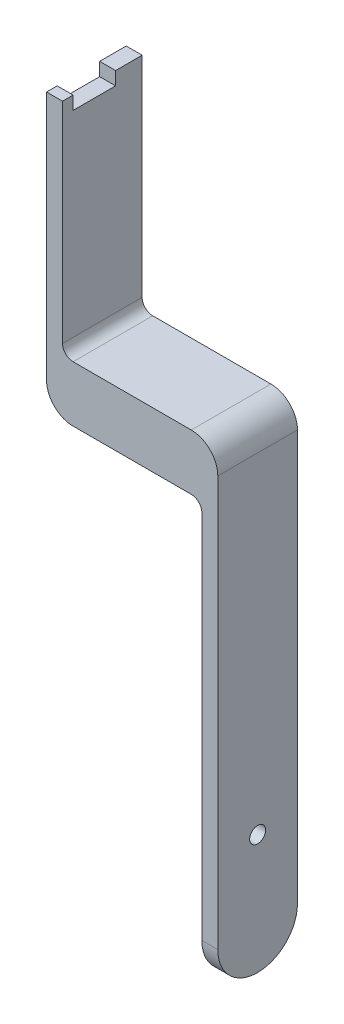
ISO-10303-21;
HEADER;
FILE_DESCRIPTION(('STEP AP214'),'2;1');
FILE_NAME('part.step','',(''),(''),'','','');
FILE_SCHEMA(('AUTOMOTIVE_DESIGN { 1 0 10303 214 1 1 1 1 }'));
ENDSEC;
DATA;
#1=APPLICATION_CONTEXT('core data for automotive mechanical design processes');
#2=APPLICATION_PROTOCOL_DEFINITION('international standard','automotive_design',2000,#1);
#3=PRODUCT_CONTEXT('',#1,'mechanical');
#4=PRODUCT('Part','Part','',(#3));
#5=PRODUCT_RELATED_PRODUCT_CATEGORY('part','',(#4));
#6=PRODUCT_DEFINITION_FORMATION('','',#4);
#7=PRODUCT_DEFINITION_CONTEXT('part definition',#1,'design');
#8=PRODUCT_DEFINITION('design','',#6,#7);
#9=PRODUCT_DEFINITION_SHAPE('','',#8);
#10=(LENGTH_UNIT() NAMED_UNIT(*) SI_UNIT(.MILLI.,.METRE.));
#11=(NAMED_UNIT(*) PLANE_ANGLE_UNIT() SI_UNIT($,.RADIAN.));
#12=(NAMED_UNIT(*) SI_UNIT($,.STERADIAN.) SOLID_ANGLE_UNIT());
#13=UNCERTAINTY_MEASURE_WITH_UNIT(LENGTH_MEASURE(1.E-05),#10,'distance_accuracy_value','');
#14=(GEOMETRIC_REPRESENTATION_CONTEXT(3) GLOBAL_UNCERTAINTY_ASSIGNED_CONTEXT((#13)) GLOBAL_UNIT_ASSIGNED_CONTEXT((#10,
#11,#12)) REPRESENTATION_CONTEXT('',''));
#15=CARTESIAN_POINT('',(0.,0.,0.));
#16=DIRECTION('',(0.,0.,1.));
#17=DIRECTION('',(1.,0.,0.));
#18=AXIS2_PLACEMENT_3D('',#15,#16,#17);
#19=CARTESIAN_POINT('',(39.9999999999999,44.5022128562179,-105.530592625912));
#20=DIRECTION('',(0.,1.,0.));
#21=DIRECTION('',(0.,0.,1.));
#22=AXIS2_PLACEMENT_3D('',#19,#20,#21);
#23=PLANE('',#22);
#24=DIRECTION('',(-1.,0.,0.));
#25=VECTOR('',#24,1.);
#26=CARTESIAN_POINT('',(72.251106428109,44.5022128562179,-92.5305926259119));
#27=LINE('',#26,#25);
#28=CARTESIAN_POINT('',(43.,44.5022128562179,-92.5305926259119));
#29=VERTEX_POINT('',#28);
#30=CARTESIAN_POINT('',(39.9999999999999,44.5022128562179,-92.5305926259119));
#31=VERTEX_POINT('',#30);
#32=EDGE_CURVE('E147',#29,#31,#27,.T.);
#33=ORIENTED_EDGE('',*,*,#32,.T.);
#34=DIRECTION('',(0.,0.,1.));
#35=VECTOR('',#34,1.);
#36=CARTESIAN_POINT('',(39.9999999999999,44.5022128562179,-105.530592625912));
#37=LINE('',#36,#35);
#38=CARTESIAN_POINT('',(39.9999999999999,44.5022128562179,-90.5305926259119));
#39=VERTEX_POINT('',#38);
#40=EDGE_CURVE('E161',#31,#39,#37,.T.);
#41=ORIENTED_EDGE('',*,*,#40,.T.);
#42=DIRECTION('',(1.,0.,0.));
#43=VECTOR('',#42,1.);
#44=CARTESIAN_POINT('',(39.9999999999999,44.5022128562179,-90.5305926259119));
#45=LINE('',#44,#43);
#46=CARTESIAN_POINT('',(43.,44.5022128562179,-90.5305926259118));
#47=VERTEX_POINT('',#46);
#48=EDGE_CURVE('E193',#39,#47,#45,.T.);
#49=ORIENTED_EDGE('',*,*,#48,.T.);
#50=DIRECTION('',(0.,0.,-1.));
#51=VECTOR('',#50,1.);
#52=CARTESIAN_POINT('',(43.,44.5022128562179,-90.5305926259118));
#53=LINE('',#52,#51);
#54=EDGE_CURVE('E164',#47,#29,#53,.T.);
#55=ORIENTED_EDGE('',*,*,#54,.T.);
#56=EDGE_LOOP('',(#33,#41,#49,#55));
#57=FACE_BOUND('',#56,.T.);
#58=ADVANCED_FACE('F33',(#57),#23,.T.);
#59=CARTESIAN_POINT('',(39.9999999999999,-79.2511064281089,-98.0305926259119));
#60=DIRECTION('',(1.,0.,0.));
#61=DIRECTION('',(0.,0.,-1.));
#62=AXIS2_PLACEMENT_3D('',#59,#60,#61);
#63=CYLINDRICAL_SURFACE('',#62,7.50000000000005);
#64=CARTESIAN_POINT('',(69.2511064281086,-79.2511064281089,-98.0305926259119));
#65=DIRECTION('',(1.,0.,0.));
#66=DIRECTION('',(0.,1.,0.));
#67=AXIS2_PLACEMENT_3D('',#64,#65,#66);
#68=CIRCLE('',#67,7.50000000000005);
#69=CARTESIAN_POINT('',(69.2511064281086,-79.2511064281089,-105.530592625912));
#70=VERTEX_POINT('',#69);
#71=CARTESIAN_POINT('',(69.2511064281086,-79.2511064281089,-90.5305926259118));
#72=VERTEX_POINT('',#71);
#73=EDGE_CURVE('E254',#70,#72,#68,.F.);
#74=ORIENTED_EDGE('',*,*,#73,.F.);
#75=DIRECTION('',(1.,0.,0.));
#76=VECTOR('',#75,1.);
#77=CARTESIAN_POINT('',(39.9999999999999,-79.2511064281089,-105.530592625912));
#78=LINE('',#77,#76);
#79=CARTESIAN_POINT('',(72.2511064281089,-79.2511064281089,-105.530592625912));
#80=VERTEX_POINT('',#79);
#81=EDGE_CURVE('E182',#70,#80,#78,.T.);
#82=ORIENTED_EDGE('',*,*,#81,.T.);
#83=CARTESIAN_POINT('',(72.2511064281089,-79.2511064281089,-98.0305926259119));
#84=DIRECTION('',(1.,0.,0.));
#85=DIRECTION('',(0.,0.,-1.));
#86=AXIS2_PLACEMENT_3D('',#83,#84,#85);
#87=CIRCLE('',#86,7.50000000000005);
#88=CARTESIAN_POINT('',(72.2511064281089,-79.2511064281089,-90.5305926259119));
#89=VERTEX_POINT('',#88);
#90=EDGE_CURVE('E183',#89,#80,#87,.T.);
#91=ORIENTED_EDGE('',*,*,#90,.F.);
#92=DIRECTION('',(1.,0.,0.));
#93=VECTOR('',#92,1.);
#94=CARTESIAN_POINT('',(39.9999999999999,-79.2511064281089,-90.5305926259119));
#95=LINE('',#94,#93);
#96=EDGE_CURVE('E189',#72,#89,#95,.T.);
#97=ORIENTED_EDGE('',*,*,#96,.F.);
#98=EDGE_LOOP('',(#74,#82,#91,#97));
#99=FACE_BOUND('',#98,.T.);
#100=ADVANCED_FACE('F309',(#99),#63,.T.);
#101=CARTESIAN_POINT('',(39.9999999999999,44.5022128562179,-90.5305926259119));
#102=DIRECTION('',(0.,0.,1.));
#103=DIRECTION('',(0.,-1.,0.));
#104=AXIS2_PLACEMENT_3D('',#101,#102,#103);
#105=PLANE('',#104);
#106=DIRECTION('',(0.,-1.,0.));
#107=VECTOR('',#106,1.);
#108=CARTESIAN_POINT('',(39.9999999999999,44.5022128562179,-90.5305926259119));
#109=LINE('',#108,#107);
#110=CARTESIAN_POINT('',(39.9999999999999,-2.50000000000003,-90.5305926259119));
#111=VERTEX_POINT('',#110);
#112=EDGE_CURVE('E172',#39,#111,#109,.T.);
#113=ORIENTED_EDGE('',*,*,#112,.T.);
#114=CARTESIAN_POINT('',(44.9999999999999,-2.50000000000005,-90.5305926259119));
#115=DIRECTION('',(0.,0.,1.));
#116=DIRECTION('',(0.,-1.,0.));
#117=AXIS2_PLACEMENT_3D('',#114,#115,#116);
#118=CIRCLE('',#117,5.);
#119=CARTESIAN_POINT('',(44.9999999999999,-7.50000000000005,-90.5305926259118));
#120=VERTEX_POINT('',#119);
#121=EDGE_CURVE('E238',#111,#120,#118,.T.);
#122=ORIENTED_EDGE('',*,*,#121,.T.);
#123=DIRECTION('',(1.,0.,0.));
#124=VECTOR('',#123,1.);
#125=CARTESIAN_POINT('',(39.9999999999996,-7.50000000000004,-90.5305926259118));
#126=LINE('',#125,#124);
#127=CARTESIAN_POINT('',(67.2511064281086,-7.50000000000005,-90.5305926259118));
#128=VERTEX_POINT('',#127);
#129=EDGE_CURVE('E273',#120,#128,#126,.T.);
#130=ORIENTED_EDGE('',*,*,#129,.T.);
#131=CARTESIAN_POINT('',(67.2511064281086,-9.50000000000005,-90.5305926259119));
#132=DIRECTION('',(0.,0.,1.));
#133=DIRECTION('',(0.,-1.,0.));
#134=AXIS2_PLACEMENT_3D('',#131,#132,#133);
#135=CIRCLE('',#134,2.);
#136=CARTESIAN_POINT('',(69.2511064281086,-9.50000000000005,-90.5305926259118));
#137=VERTEX_POINT('',#136);
#138=EDGE_CURVE('E226',#128,#137,#135,.F.);
#139=ORIENTED_EDGE('',*,*,#138,.T.);
#140=DIRECTION('',(0.,-1.,0.));
#141=VECTOR('',#140,1.);
#142=CARTESIAN_POINT('',(69.2511064281086,-7.50000000000005,-90.5305926259118));
#143=LINE('',#142,#141);
#144=EDGE_CURVE('E258',#137,#72,#143,.T.);
#145=ORIENTED_EDGE('',*,*,#144,.T.);
#146=ORIENTED_EDGE('',*,*,#96,.T.);
#147=DIRECTION('',(0.,-1.,0.));
#148=VECTOR('',#147,1.);
#149=CARTESIAN_POINT('',(72.2511064281089,44.5022128562179,-90.5305926259119));
#150=LINE('',#149,#148);
#151=CARTESIAN_POINT('',(72.2511064281089,-1.99999999999998,-90.5305926259119));
#152=VERTEX_POINT('',#151);
#153=EDGE_CURVE('E177',#152,#89,#150,.T.);
#154=ORIENTED_EDGE('',*,*,#153,.F.);
#155=CARTESIAN_POINT('',(67.2511064281089,-2.,-90.5305926259119));
#156=DIRECTION('',(0.,0.,1.));
#157=DIRECTION('',(0.,-1.,0.));
#158=AXIS2_PLACEMENT_3D('',#155,#156,#157);
#159=CIRCLE('',#158,5.);
#160=CARTESIAN_POINT('',(67.2511064281089,3.,-90.5305926259118));
#161=VERTEX_POINT('',#160);
#162=EDGE_CURVE('E48',#152,#161,#159,.T.);
#163=ORIENTED_EDGE('',*,*,#162,.T.);
#164=DIRECTION('',(-1.,0.,0.));
#165=VECTOR('',#164,1.);
#166=CARTESIAN_POINT('',(72.251106428109,3.,-90.5305926259118));
#167=LINE('',#166,#165);
#168=CARTESIAN_POINT('',(44.9999999999999,3.,-90.5305926259118));
#169=VERTEX_POINT('',#168);
#170=EDGE_CURVE('E245',#161,#169,#167,.T.);
#171=ORIENTED_EDGE('',*,*,#170,.T.);
#172=CARTESIAN_POINT('',(44.9999999999999,5.,-90.5305926259119));
#173=DIRECTION('',(0.,0.,1.));
#174=DIRECTION('',(0.,-1.,0.));
#175=AXIS2_PLACEMENT_3D('',#172,#173,#174);
#176=CIRCLE('',#175,2.);
#177=CARTESIAN_POINT('',(42.9999999999999,5.00000000000001,-90.5305926259118));
#178=VERTEX_POINT('',#177);
#179=EDGE_CURVE('E221',#169,#178,#176,.F.);
#180=ORIENTED_EDGE('',*,*,#179,.T.);
#181=DIRECTION('',(0.,1.,0.));
#182=VECTOR('',#181,1.);
#183=CARTESIAN_POINT('',(42.9999999999999,3.,-90.5305926259118));
#184=LINE('',#183,#182);
#185=EDGE_CURVE('E261',#178,#47,#184,.T.);
#186=ORIENTED_EDGE('',*,*,#185,.T.);
#187=ORIENTED_EDGE('',*,*,#48,.F.);
#188=EDGE_LOOP('',(#113,#122,#130,#139,#145,#146,#154,#163,#171,#180,#186,#187));
#189=FACE_BOUND('',#188,.T.);
#190=ADVANCED_FACE('F311',(#189),#105,.T.);
#191=DIRECTION('',(-1.,0.,0.));
#192=VECTOR('',#191,1.);
#193=CARTESIAN_POINT('',(72.251106428109,44.5022128562179,-100.530592625912));
#194=LINE('',#193,#192);
#195=CARTESIAN_POINT('',(43.,44.5022128562179,-100.530592625912));
#196=VERTEX_POINT('',#195);
#197=CARTESIAN_POINT('',(39.9999999999999,44.5022128562179,-100.530592625912));
#198=VERTEX_POINT('',#197);
#199=EDGE_CURVE('E165',#196,#198,#194,.T.);
#200=ORIENTED_EDGE('',*,*,#199,.F.);
#201=CARTESIAN_POINT('',(43.,44.5022128562179,-105.530592625912));
#202=VERTEX_POINT('',#201);
#203=EDGE_CURVE('E263',#196,#202,#53,.T.);
#204=ORIENTED_EDGE('',*,*,#203,.T.);
#205=DIRECTION('',(1.,0.,0.));
#206=VECTOR('',#205,1.);
#207=CARTESIAN_POINT('',(39.9999999999999,44.5022128562179,-105.530592625912));
#208=LINE('',#207,#206);
#209=CARTESIAN_POINT('',(39.9999999999999,44.5022128562179,-105.530592625912));
#210=VERTEX_POINT('',#209);
#211=EDGE_CURVE('E195',#210,#202,#208,.T.);
#212=ORIENTED_EDGE('',*,*,#211,.F.);
#213=EDGE_CURVE('E173',#210,#198,#37,.T.);
#214=ORIENTED_EDGE('',*,*,#213,.T.);
#215=EDGE_LOOP('',(#200,#204,#212,#214));
#216=FACE_BOUND('',#215,.T.);
#217=ADVANCED_FACE('F320',(#216),#23,.T.);
#218=CARTESIAN_POINT('',(39.9999999999999,-79.2511064281089,-105.530592625912));
#219=DIRECTION('',(0.,0.,-1.));
#220=DIRECTION('',(-1.,0.,0.));
#221=AXIS2_PLACEMENT_3D('',#218,#219,#220);
#222=PLANE('',#221);
#223=DIRECTION('',(1.,0.,0.));
#224=VECTOR('',#223,1.);
#225=CARTESIAN_POINT('',(39.9999999999996,-7.50000000000004,-105.530592625912));
#226=LINE('',#225,#224);
#227=CARTESIAN_POINT('',(44.9999999999999,-7.50000000000005,-105.530592625912));
#228=VERTEX_POINT('',#227);
#229=CARTESIAN_POINT('',(67.2511064281086,-7.50000000000005,-105.530592625912));
#230=VERTEX_POINT('',#229);
#231=EDGE_CURVE('E274',#228,#230,#226,.T.);
#232=ORIENTED_EDGE('',*,*,#231,.F.);
#233=CARTESIAN_POINT('',(44.9999999999999,-2.50000000000005,-105.530592625912));
#234=DIRECTION('',(0.,0.,-1.));
#235=DIRECTION('',(-1.,0.,0.));
#236=AXIS2_PLACEMENT_3D('',#233,#234,#235);
#237=CIRCLE('',#236,5.);
#238=CARTESIAN_POINT('',(39.9999999999999,-2.50000000000007,-105.530592625912));
#239=VERTEX_POINT('',#238);
#240=EDGE_CURVE('E233',#228,#239,#237,.T.);
#241=ORIENTED_EDGE('',*,*,#240,.T.);
#242=DIRECTION('',(0.,1.,0.));
#243=VECTOR('',#242,1.);
#244=CARTESIAN_POINT('',(39.9999999999999,-79.2511064281089,-105.530592625912));
#245=LINE('',#244,#243);
#246=EDGE_CURVE('E174',#239,#210,#245,.T.);
#247=ORIENTED_EDGE('',*,*,#246,.T.);
#248=ORIENTED_EDGE('',*,*,#211,.T.);
#249=DIRECTION('',(0.,1.,0.));
#250=VECTOR('',#249,1.);
#251=CARTESIAN_POINT('',(42.9999999999999,3.,-105.530592625912));
#252=LINE('',#251,#250);
#253=CARTESIAN_POINT('',(42.9999999999999,5.00000000000001,-105.530592625912));
#254=VERTEX_POINT('',#253);
#255=EDGE_CURVE('E253',#254,#202,#252,.T.);
#256=ORIENTED_EDGE('',*,*,#255,.F.);
#257=CARTESIAN_POINT('',(44.9999999999999,5.,-105.530592625912));
#258=DIRECTION('',(0.,0.,-1.));
#259=DIRECTION('',(-1.,0.,0.));
#260=AXIS2_PLACEMENT_3D('',#257,#258,#259);
#261=CIRCLE('',#260,2.);
#262=CARTESIAN_POINT('',(44.9999999999999,3.,-105.530592625912));
#263=VERTEX_POINT('',#262);
#264=EDGE_CURVE('E218',#254,#263,#261,.F.);
#265=ORIENTED_EDGE('',*,*,#264,.T.);
#266=DIRECTION('',(-1.,0.,0.));
#267=VECTOR('',#266,1.);
#268=CARTESIAN_POINT('',(72.251106428109,3.,-105.530592625912));
#269=LINE('',#268,#267);
#270=CARTESIAN_POINT('',(67.2511064281089,3.,-105.530592625912));
#271=VERTEX_POINT('',#270);
#272=EDGE_CURVE('E244',#271,#263,#269,.T.);
#273=ORIENTED_EDGE('',*,*,#272,.F.);
#274=CARTESIAN_POINT('',(67.2511064281089,-2.,-105.530592625912));
#275=DIRECTION('',(0.,0.,-1.));
#276=DIRECTION('',(-1.,0.,0.));
#277=AXIS2_PLACEMENT_3D('',#274,#275,#276);
#278=CIRCLE('',#277,5.);
#279=CARTESIAN_POINT('',(72.2511064281089,-2.00000000000003,-105.530592625912));
#280=VERTEX_POINT('',#279);
#281=EDGE_CURVE('E231',#271,#280,#278,.T.);
#282=ORIENTED_EDGE('',*,*,#281,.T.);
#283=DIRECTION('',(0.,1.,0.));
#284=VECTOR('',#283,1.);
#285=CARTESIAN_POINT('',(72.2511064281089,-79.2511064281089,-105.530592625912));
#286=LINE('',#285,#284);
#287=EDGE_CURVE('E186',#80,#280,#286,.T.);
#288=ORIENTED_EDGE('',*,*,#287,.F.);
#289=ORIENTED_EDGE('',*,*,#81,.F.);
#290=DIRECTION('',(0.,-1.,0.));
#291=VECTOR('',#290,1.);
#292=CARTESIAN_POINT('',(69.2511064281086,-7.50000000000005,-105.530592625912));
#293=LINE('',#292,#291);
#294=CARTESIAN_POINT('',(69.2511064281086,-9.50000000000005,-105.530592625912));
#295=VERTEX_POINT('',#294);
#296=EDGE_CURVE('E271',#295,#70,#293,.T.);
#297=ORIENTED_EDGE('',*,*,#296,.F.);
#298=CARTESIAN_POINT('',(67.2511064281086,-9.50000000000005,-105.530592625912));
#299=DIRECTION('',(0.,0.,-1.));
#300=DIRECTION('',(-1.,0.,0.));
#301=AXIS2_PLACEMENT_3D('',#298,#299,#300);
#302=CIRCLE('',#301,2.);
#303=EDGE_CURVE('E223',#295,#230,#302,.F.);
#304=ORIENTED_EDGE('',*,*,#303,.T.);
#305=EDGE_LOOP('',(#232,#241,#247,#248,#256,#265,#273,#282,#288,#289,#297,#304));
#306=FACE_BOUND('',#305,.T.);
#307=ADVANCED_FACE('F249',(#306),#222,.T.);
#308=CARTESIAN_POINT('',(39.9999999999999,-79.2511064281089,-98.0305926259119));
#309=DIRECTION('',(1.,0.,0.));
#310=DIRECTION('',(0.,0.,-1.));
#311=AXIS2_PLACEMENT_3D('',#308,#309,#310);
#312=PLANE('',#311);
#313=ORIENTED_EDGE('',*,*,#246,.F.);
#314=DIRECTION('',(0.,0.,-1.));
#315=VECTOR('',#314,1.);
#316=CARTESIAN_POINT('',(39.9999999999999,-2.50000000000004,-98.0305926259119));
#317=LINE('',#316,#315);
#318=EDGE_CURVE('E235',#239,#111,#317,.F.);
#319=ORIENTED_EDGE('',*,*,#318,.T.);
#320=ORIENTED_EDGE('',*,*,#112,.F.);
#321=ORIENTED_EDGE('',*,*,#40,.F.);
#322=DIRECTION('',(0.,1.,0.));
#323=VECTOR('',#322,1.);
#324=CARTESIAN_POINT('',(39.9999999999999,42.0022128562179,-92.5305926259119));
#325=LINE('',#324,#323);
#326=CARTESIAN_POINT('',(39.9999999999999,42.0022128562179,-92.5305926259119));
#327=VERTEX_POINT('',#326);
#328=EDGE_CURVE('E144',#327,#31,#325,.T.);
#329=ORIENTED_EDGE('',*,*,#328,.F.);
#330=DIRECTION('',(0.,0.,1.));
#331=VECTOR('',#330,1.);
#332=CARTESIAN_POINT('',(39.9999999999999,42.0022128562179,-100.530592625912));
#333=LINE('',#332,#331);
#334=CARTESIAN_POINT('',(39.9999999999999,42.0022128562179,-100.530592625912));
#335=VERTEX_POINT('',#334);
#336=EDGE_CURVE('E166',#335,#327,#333,.T.);
#337=ORIENTED_EDGE('',*,*,#336,.F.);
#338=DIRECTION('',(0.,-1.,0.));
#339=VECTOR('',#338,1.);
#340=CARTESIAN_POINT('',(39.9999999999999,44.5022128562179,-100.530592625912));
#341=LINE('',#340,#339);
#342=EDGE_CURVE('E155',#198,#335,#341,.T.);
#343=ORIENTED_EDGE('',*,*,#342,.F.);
#344=ORIENTED_EDGE('',*,*,#213,.F.);
#345=EDGE_LOOP('',(#313,#319,#320,#321,#329,#337,#343,#344));
#346=FACE_BOUND('',#345,.T.);
#347=ADVANCED_FACE('F170',(#346),#312,.F.);
#348=CARTESIAN_POINT('',(72.2511064281089,-79.2511064281089,-98.0305926259119));
#349=DIRECTION('',(1.,0.,0.));
#350=DIRECTION('',(0.,0.,-1.));
#351=AXIS2_PLACEMENT_3D('',#348,#349,#350);
#352=PLANE('',#351);
#353=CARTESIAN_POINT('',(72.2511064281087,-64.2511064281086,-98.0305926259119));
#354=DIRECTION('',(-1.,0.,0.));
#355=DIRECTION('',(0.,0.,1.));
#356=AXIS2_PLACEMENT_3D('',#353,#354,#355);
#357=CIRCLE('',#356,1.49999999999999);
#358=CARTESIAN_POINT('',(72.2511064281087,-64.2511064281086,-96.5305926259119));
#359=VERTEX_POINT('',#358);
#360=EDGE_CURVE('E156',#359,#359,#357,.T.);
#361=ORIENTED_EDGE('',*,*,#360,.T.);
#362=EDGE_LOOP('',(#361));
#363=FACE_BOUND('',#362,.T.);
#364=ORIENTED_EDGE('',*,*,#287,.T.);
#365=DIRECTION('',(0.,0.,-1.));
#366=VECTOR('',#365,1.);
#367=CARTESIAN_POINT('',(72.2511064281089,-2.,-90.5305926259119));
#368=LINE('',#367,#366);
#369=EDGE_CURVE('E11',#280,#152,#368,.F.);
#370=ORIENTED_EDGE('',*,*,#369,.T.);
#371=ORIENTED_EDGE('',*,*,#153,.T.);
#372=ORIENTED_EDGE('',*,*,#90,.T.);
#373=EDGE_LOOP('',(#364,#370,#371,#372));
#374=FACE_BOUND('',#373,.T.);
#375=ADVANCED_FACE('F356',(#363,#374),#352,.T.);
#376=CARTESIAN_POINT('',(42.9999999999999,3.,-90.5305926259118));
#377=DIRECTION('',(-1.,0.,0.));
#378=DIRECTION('',(0.,-1.,0.));
#379=AXIS2_PLACEMENT_3D('',#376,#377,#378);
#380=PLANE('',#379);
#381=ORIENTED_EDGE('',*,*,#185,.F.);
#382=DIRECTION('',(0.,0.,-1.));
#383=VECTOR('',#382,1.);
#384=CARTESIAN_POINT('',(42.9999999999999,5.00000000000001,-105.530592625912));
#385=LINE('',#384,#383);
#386=EDGE_CURVE('E206',#178,#254,#385,.T.);
#387=ORIENTED_EDGE('',*,*,#386,.T.);
#388=ORIENTED_EDGE('',*,*,#255,.T.);
#389=ORIENTED_EDGE('',*,*,#203,.F.);
#390=DIRECTION('',(0.,-1.,0.));
#391=VECTOR('',#390,1.);
#392=CARTESIAN_POINT('',(42.9999999999999,3.,-100.530592625912));
#393=LINE('',#392,#391);
#394=CARTESIAN_POINT('',(43.,42.0022128562179,-100.530592625912));
#395=VERTEX_POINT('',#394);
#396=EDGE_CURVE('E192',#196,#395,#393,.T.);
#397=ORIENTED_EDGE('',*,*,#396,.T.);
#398=DIRECTION('',(0.,0.,1.));
#399=VECTOR('',#398,1.);
#400=CARTESIAN_POINT('',(43.,42.0022128562179,-90.5305926259118));
#401=LINE('',#400,#399);
#402=CARTESIAN_POINT('',(43.,42.0022128562179,-92.5305926259119));
#403=VERTEX_POINT('',#402);
#404=EDGE_CURVE('E201',#395,#403,#401,.T.);
#405=ORIENTED_EDGE('',*,*,#404,.T.);
#406=DIRECTION('',(0.,1.,0.));
#407=VECTOR('',#406,1.);
#408=CARTESIAN_POINT('',(42.9999999999999,3.,-92.5305926259119));
#409=LINE('',#408,#407);
#410=EDGE_CURVE('E204',#403,#29,#409,.T.);
#411=ORIENTED_EDGE('',*,*,#410,.T.);
#412=ORIENTED_EDGE('',*,*,#54,.F.);
#413=EDGE_LOOP('',(#381,#387,#388,#389,#397,#405,#411,#412));
#414=FACE_BOUND('',#413,.T.);
#415=ADVANCED_FACE('F336',(#414),#380,.F.);
#416=CARTESIAN_POINT('',(72.251106428109,3.,-90.5305926259118));
#417=DIRECTION('',(0.,-1.,0.));
#418=DIRECTION('',(0.,0.,-1.));
#419=AXIS2_PLACEMENT_3D('',#416,#417,#418);
#420=PLANE('',#419);
#421=ORIENTED_EDGE('',*,*,#170,.F.);
#422=DIRECTION('',(0.,0.,-1.));
#423=VECTOR('',#422,1.);
#424=CARTESIAN_POINT('',(67.2511064281089,3.,-105.530592625912));
#425=LINE('',#424,#423);
#426=EDGE_CURVE('E41',#161,#271,#425,.T.);
#427=ORIENTED_EDGE('',*,*,#426,.T.);
#428=ORIENTED_EDGE('',*,*,#272,.T.);
#429=DIRECTION('',(0.,0.,-1.));
#430=VECTOR('',#429,1.);
#431=CARTESIAN_POINT('',(44.9999999999999,3.,-90.5305926259118));
#432=LINE('',#431,#430);
#433=EDGE_CURVE('E209',#263,#169,#432,.F.);
#434=ORIENTED_EDGE('',*,*,#433,.T.);
#435=EDGE_LOOP('',(#421,#427,#428,#434));
#436=FACE_BOUND('',#435,.T.);
#437=ADVANCED_FACE('F243',(#436),#420,.F.);
#438=CARTESIAN_POINT('',(69.2511064281086,-7.50000000000005,-90.5305926259118));
#439=DIRECTION('',(1.,0.,0.));
#440=DIRECTION('',(0.,1.,0.));
#441=AXIS2_PLACEMENT_3D('',#438,#439,#440);
#442=PLANE('',#441);
#443=CARTESIAN_POINT('',(69.2511064281083,-64.2511064281086,-98.0305926259119));
#444=DIRECTION('',(-1.,0.,0.));
#445=DIRECTION('',(0.,0.,1.));
#446=AXIS2_PLACEMENT_3D('',#443,#444,#445);
#447=CIRCLE('',#446,1.49999999999999);
#448=CARTESIAN_POINT('',(69.2511064281083,-64.2511064281086,-96.5305926259119));
#449=VERTEX_POINT('',#448);
#450=EDGE_CURVE('E287',#449,#449,#447,.T.);
#451=ORIENTED_EDGE('',*,*,#450,.F.);
#452=EDGE_LOOP('',(#451));
#453=FACE_BOUND('',#452,.T.);
#454=ORIENTED_EDGE('',*,*,#144,.F.);
#455=DIRECTION('',(0.,0.,-1.));
#456=VECTOR('',#455,1.);
#457=CARTESIAN_POINT('',(69.2511064281086,-9.50000000000005,-105.530592625912));
#458=LINE('',#457,#456);
#459=EDGE_CURVE('E212',#137,#295,#458,.T.);
#460=ORIENTED_EDGE('',*,*,#459,.T.);
#461=ORIENTED_EDGE('',*,*,#296,.T.);
#462=ORIENTED_EDGE('',*,*,#73,.T.);
#463=EDGE_LOOP('',(#454,#460,#461,#462));
#464=FACE_BOUND('',#463,.T.);
#465=ADVANCED_FACE('F293',(#453,#464),#442,.F.);
#466=CARTESIAN_POINT('',(39.9999999999996,-7.50000000000004,-90.5305926259118));
#467=DIRECTION('',(0.,1.,0.));
#468=DIRECTION('',(-1.,0.,0.));
#469=AXIS2_PLACEMENT_3D('',#466,#467,#468);
#470=PLANE('',#469);
#471=ORIENTED_EDGE('',*,*,#129,.F.);
#472=DIRECTION('',(0.,0.,-1.));
#473=VECTOR('',#472,1.);
#474=CARTESIAN_POINT('',(44.9999999999999,-7.50000000000005,-90.5305926259118));
#475=LINE('',#474,#473);
#476=EDGE_CURVE('E228',#120,#228,#475,.T.);
#477=ORIENTED_EDGE('',*,*,#476,.T.);
#478=ORIENTED_EDGE('',*,*,#231,.T.);
#479=DIRECTION('',(0.,0.,-1.));
#480=VECTOR('',#479,1.);
#481=CARTESIAN_POINT('',(67.2511064281086,-7.50000000000005,-90.5305926259118));
#482=LINE('',#481,#480);
#483=EDGE_CURVE('E215',#230,#128,#482,.F.);
#484=ORIENTED_EDGE('',*,*,#483,.T.);
#485=EDGE_LOOP('',(#471,#477,#478,#484));
#486=FACE_BOUND('',#485,.T.);
#487=ADVANCED_FACE('F296',(#486),#470,.F.);
#488=CARTESIAN_POINT('',(72.251106428109,42.0022128562179,-92.5305926259119));
#489=DIRECTION('',(0.,0.,1.));
#490=DIRECTION('',(1.,0.,0.));
#491=AXIS2_PLACEMENT_3D('',#488,#489,#490);
#492=PLANE('',#491);
#493=DIRECTION('',(-1.,0.,0.));
#494=VECTOR('',#493,1.);
#495=CARTESIAN_POINT('',(72.251106428109,42.0022128562179,-92.5305926259119));
#496=LINE('',#495,#494);
#497=EDGE_CURVE('E150',#403,#327,#496,.T.);
#498=ORIENTED_EDGE('',*,*,#497,.T.);
#499=ORIENTED_EDGE('',*,*,#328,.T.);
#500=ORIENTED_EDGE('',*,*,#32,.F.);
#501=ORIENTED_EDGE('',*,*,#410,.F.);
#502=EDGE_LOOP('',(#498,#499,#500,#501));
#503=FACE_BOUND('',#502,.T.);
#504=ADVANCED_FACE('F146',(#503),#492,.F.);
#505=CARTESIAN_POINT('',(72.251106428109,42.0022128562179,-100.530592625912));
#506=DIRECTION('',(0.,-1.,0.));
#507=DIRECTION('',(0.,0.,-1.));
#508=AXIS2_PLACEMENT_3D('',#505,#506,#507);
#509=PLANE('',#508);
#510=DIRECTION('',(-1.,0.,0.));
#511=VECTOR('',#510,1.);
#512=CARTESIAN_POINT('',(72.251106428109,42.0022128562179,-100.530592625912));
#513=LINE('',#512,#511);
#514=EDGE_CURVE('E279',#395,#335,#513,.T.);
#515=ORIENTED_EDGE('',*,*,#514,.T.);
#516=ORIENTED_EDGE('',*,*,#336,.T.);
#517=ORIENTED_EDGE('',*,*,#497,.F.);
#518=ORIENTED_EDGE('',*,*,#404,.F.);
#519=EDGE_LOOP('',(#515,#516,#517,#518));
#520=FACE_BOUND('',#519,.T.);
#521=ADVANCED_FACE('F342',(#520),#509,.F.);
#522=CARTESIAN_POINT('',(72.251106428109,44.5022128562179,-100.530592625912));
#523=DIRECTION('',(0.,0.,-1.));
#524=DIRECTION('',(-1.,0.,0.));
#525=AXIS2_PLACEMENT_3D('',#522,#523,#524);
#526=PLANE('',#525);
#527=ORIENTED_EDGE('',*,*,#199,.T.);
#528=ORIENTED_EDGE('',*,*,#342,.T.);
#529=ORIENTED_EDGE('',*,*,#514,.F.);
#530=ORIENTED_EDGE('',*,*,#396,.F.);
#531=EDGE_LOOP('',(#527,#528,#529,#530));
#532=FACE_BOUND('',#531,.T.);
#533=ADVANCED_FACE('F339',(#532),#526,.F.);
#534=CARTESIAN_POINT('',(69.2511064281083,-64.2511064281086,-98.0305926259119));
#535=DIRECTION('',(-1.,0.,0.));
#536=DIRECTION('',(0.,0.,1.));
#537=AXIS2_PLACEMENT_3D('',#534,#535,#536);
#538=CYLINDRICAL_SURFACE('',#537,1.49999999999999);
#539=ORIENTED_EDGE('',*,*,#360,.F.);
#540=EDGE_LOOP('',(#539));
#541=FACE_BOUND('',#540,.T.);
#542=ORIENTED_EDGE('',*,*,#450,.T.);
#543=EDGE_LOOP('',(#542));
#544=FACE_BOUND('',#543,.T.);
#545=ADVANCED_FACE('F291',(#541,#544),#538,.F.);
#546=CARTESIAN_POINT('',(44.9999999999999,5.,-90.5305926259118));
#547=DIRECTION('',(0.,0.,1.));
#548=DIRECTION('',(1.,0.,0.));
#549=AXIS2_PLACEMENT_3D('',#546,#547,#548);
#550=CYLINDRICAL_SURFACE('',#549,2.);
#551=ORIENTED_EDGE('',*,*,#179,.F.);
#552=ORIENTED_EDGE('',*,*,#433,.F.);
#553=ORIENTED_EDGE('',*,*,#264,.F.);
#554=ORIENTED_EDGE('',*,*,#386,.F.);
#555=EDGE_LOOP('',(#551,#552,#553,#554));
#556=FACE_BOUND('',#555,.T.);
#557=ADVANCED_FACE('F368',(#556),#550,.F.);
#558=CARTESIAN_POINT('',(67.2511064281086,-9.50000000000005,-90.5305926259118));
#559=DIRECTION('',(0.,0.,1.));
#560=DIRECTION('',(1.,0.,0.));
#561=AXIS2_PLACEMENT_3D('',#558,#559,#560);
#562=CYLINDRICAL_SURFACE('',#561,2.);
#563=ORIENTED_EDGE('',*,*,#138,.F.);
#564=ORIENTED_EDGE('',*,*,#483,.F.);
#565=ORIENTED_EDGE('',*,*,#303,.F.);
#566=ORIENTED_EDGE('',*,*,#459,.F.);
#567=EDGE_LOOP('',(#563,#564,#565,#566));
#568=FACE_BOUND('',#567,.T.);
#569=ADVANCED_FACE('F305',(#568),#562,.F.);
#570=CARTESIAN_POINT('',(44.9999999999999,-2.50000000000005,-90.5305926259118));
#571=DIRECTION('',(0.,0.,-1.));
#572=DIRECTION('',(-1.,0.,0.));
#573=AXIS2_PLACEMENT_3D('',#570,#571,#572);
#574=CYLINDRICAL_SURFACE('',#573,5.);
#575=ORIENTED_EDGE('',*,*,#121,.F.);
#576=ORIENTED_EDGE('',*,*,#318,.F.);
#577=ORIENTED_EDGE('',*,*,#240,.F.);
#578=ORIENTED_EDGE('',*,*,#476,.F.);
#579=EDGE_LOOP('',(#575,#576,#577,#578));
#580=FACE_BOUND('',#579,.T.);
#581=ADVANCED_FACE('F313',(#580),#574,.T.);
#582=CARTESIAN_POINT('',(67.2511064281089,-2.,-90.5305926259118));
#583=DIRECTION('',(0.,0.,1.));
#584=DIRECTION('',(1.,0.,0.));
#585=AXIS2_PLACEMENT_3D('',#582,#583,#584);
#586=CYLINDRICAL_SURFACE('',#585,5.);
#587=ORIENTED_EDGE('',*,*,#162,.F.);
#588=ORIENTED_EDGE('',*,*,#369,.F.);
#589=ORIENTED_EDGE('',*,*,#281,.F.);
#590=ORIENTED_EDGE('',*,*,#426,.F.);
#591=EDGE_LOOP('',(#587,#588,#589,#590));
#592=FACE_BOUND('',#591,.T.);
#593=ADVANCED_FACE('F35',(#592),#586,.T.);
#594=CLOSED_SHELL('',(#58,#100,#190,#217,#307,#347,#375,#415,#437,#465,#487,#504,#521,#533,#545,
#557,#569,#581,#593));
#595=MANIFOLD_SOLID_BREP('B2',#594);
#596=ADVANCED_BREP_SHAPE_REPRESENTATION('',(#18,#595),#14);
#597=SHAPE_DEFINITION_REPRESENTATION(#9,#596);
ENDSEC;
END-ISO-10303-21;
